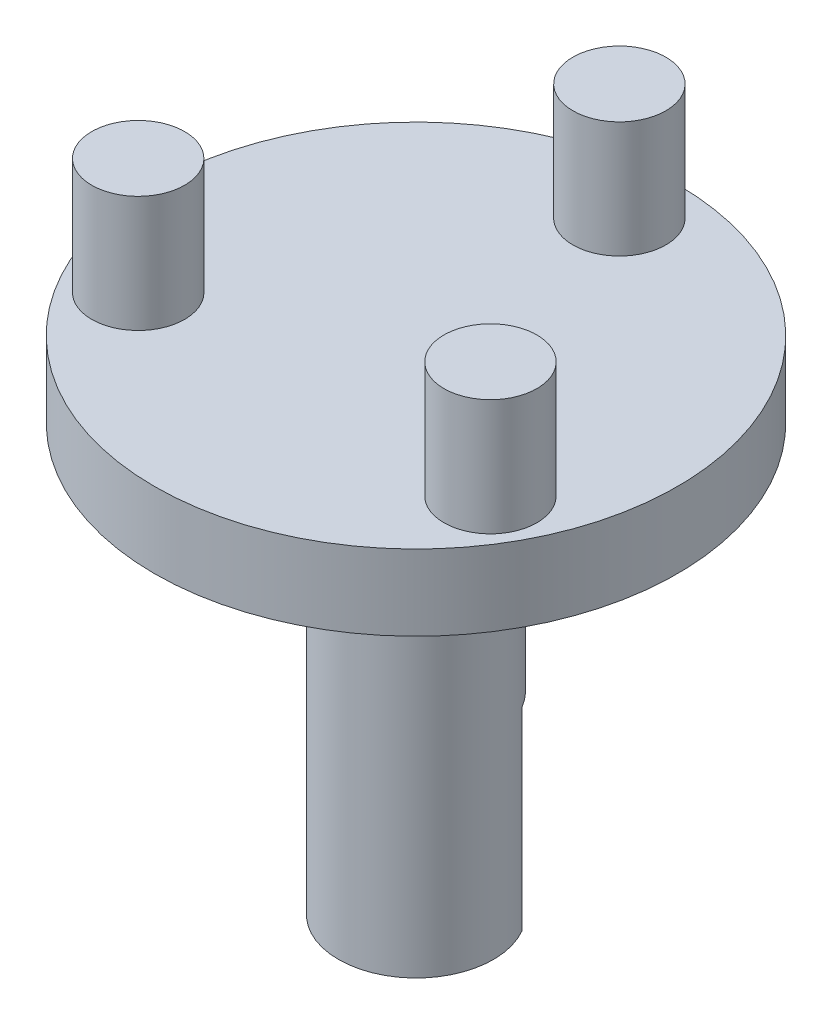
ISO-10303-21;
HEADER;
FILE_DESCRIPTION(('STEP AP214'),'2;1');
FILE_NAME('part.step','',(''),(''),'','','');
FILE_SCHEMA(('AUTOMOTIVE_DESIGN { 1 0 10303 214 1 1 1 1 }'));
ENDSEC;
DATA;
#1=APPLICATION_CONTEXT('core data for automotive mechanical design processes');
#2=APPLICATION_PROTOCOL_DEFINITION('international standard','automotive_design',2000,#1);
#3=PRODUCT_CONTEXT('',#1,'mechanical');
#4=PRODUCT('Part','Part','',(#3));
#5=PRODUCT_RELATED_PRODUCT_CATEGORY('part','',(#4));
#6=PRODUCT_DEFINITION_FORMATION('','',#4);
#7=PRODUCT_DEFINITION_CONTEXT('part definition',#1,'design');
#8=PRODUCT_DEFINITION('design','',#6,#7);
#9=PRODUCT_DEFINITION_SHAPE('','',#8);
#10=(LENGTH_UNIT() NAMED_UNIT(*) SI_UNIT(.MILLI.,.METRE.));
#11=(NAMED_UNIT(*) PLANE_ANGLE_UNIT() SI_UNIT($,.RADIAN.));
#12=(NAMED_UNIT(*) SI_UNIT($,.STERADIAN.) SOLID_ANGLE_UNIT());
#13=UNCERTAINTY_MEASURE_WITH_UNIT(LENGTH_MEASURE(1.E-05),#10,'distance_accuracy_value','');
#14=(GEOMETRIC_REPRESENTATION_CONTEXT(3) GLOBAL_UNCERTAINTY_ASSIGNED_CONTEXT((#13)) GLOBAL_UNIT_ASSIGNED_CONTEXT((#10,
#11,#12)) REPRESENTATION_CONTEXT('',''));
#15=CARTESIAN_POINT('',(0.,0.,0.));
#16=DIRECTION('',(0.,0.,1.));
#17=DIRECTION('',(1.,0.,0.));
#18=AXIS2_PLACEMENT_3D('',#15,#16,#17);
#19=CARTESIAN_POINT('',(0.,3.9,0.));
#20=DIRECTION('',(0.,-1.,0.));
#21=DIRECTION('',(0.,0.,-1.));
#22=AXIS2_PLACEMENT_3D('',#19,#20,#21);
#23=CYLINDRICAL_SURFACE('',#22,13.5);
#24=CARTESIAN_POINT('',(0.,3.9,0.));
#25=DIRECTION('',(0.,1.,0.));
#26=DIRECTION('',(0.,0.,1.));
#27=AXIS2_PLACEMENT_3D('',#24,#25,#26);
#28=CIRCLE('',#27,13.5);
#29=CARTESIAN_POINT('',(0.,3.9,13.5));
#30=VERTEX_POINT('',#29);
#31=EDGE_CURVE('E46',#30,#30,#28,.T.);
#32=ORIENTED_EDGE('',*,*,#31,.F.);
#33=EDGE_LOOP('',(#32));
#34=FACE_BOUND('',#33,.T.);
#35=CARTESIAN_POINT('',(0.,0.,0.));
#36=DIRECTION('',(0.,1.,0.));
#37=DIRECTION('',(0.,0.,1.));
#38=AXIS2_PLACEMENT_3D('',#35,#36,#37);
#39=CIRCLE('',#38,13.5);
#40=CARTESIAN_POINT('',(0.,0.,13.5));
#41=VERTEX_POINT('',#40);
#42=EDGE_CURVE('E111',#41,#41,#39,.T.);
#43=ORIENTED_EDGE('',*,*,#42,.T.);
#44=EDGE_LOOP('',(#43));
#45=FACE_BOUND('',#44,.T.);
#46=ADVANCED_FACE('F38',(#34,#45),#23,.T.);
#47=CARTESIAN_POINT('',(0.,3.9,0.));
#48=DIRECTION('',(0.,1.,0.));
#49=DIRECTION('',(0.,0.,1.));
#50=AXIS2_PLACEMENT_3D('',#47,#48,#49);
#51=PLANE('',#50);
#52=CARTESIAN_POINT('',(-9.09326673973594,3.9,5.25000000000039));
#53=DIRECTION('',(0.,1.,0.));
#54=DIRECTION('',(0.,0.,1.));
#55=AXIS2_PLACEMENT_3D('',#52,#53,#54);
#56=CIRCLE('',#55,2.4);
#57=CARTESIAN_POINT('',(-9.09326673973594,3.9,7.65000000000039));
#58=VERTEX_POINT('',#57);
#59=EDGE_CURVE('E95',#58,#58,#56,.T.);
#60=ORIENTED_EDGE('',*,*,#59,.F.);
#61=EDGE_LOOP('',(#60));
#62=FACE_BOUND('',#61,.T.);
#63=CARTESIAN_POINT('',(9.09326673973728,3.9,5.24999999999961));
#64=DIRECTION('',(0.,1.,0.));
#65=DIRECTION('',(0.,0.,1.));
#66=AXIS2_PLACEMENT_3D('',#63,#64,#65);
#67=CIRCLE('',#66,2.4);
#68=CARTESIAN_POINT('',(9.09326673973728,3.9,7.64999999999961));
#69=VERTEX_POINT('',#68);
#70=EDGE_CURVE('E94',#69,#69,#67,.T.);
#71=ORIENTED_EDGE('',*,*,#70,.F.);
#72=EDGE_LOOP('',(#71));
#73=FACE_BOUND('',#72,.T.);
#74=CARTESIAN_POINT('',(0.,3.9,-10.5));
#75=DIRECTION('',(0.,1.,0.));
#76=DIRECTION('',(0.,0.,1.));
#77=AXIS2_PLACEMENT_3D('',#74,#75,#76);
#78=CIRCLE('',#77,2.4);
#79=CARTESIAN_POINT('',(0.,3.9,-8.1));
#80=VERTEX_POINT('',#79);
#81=EDGE_CURVE('E103',#80,#80,#78,.T.);
#82=ORIENTED_EDGE('',*,*,#81,.F.);
#83=EDGE_LOOP('',(#82));
#84=FACE_BOUND('',#83,.T.);
#85=ORIENTED_EDGE('',*,*,#31,.T.);
#86=EDGE_LOOP('',(#85));
#87=FACE_BOUND('',#86,.T.);
#88=ADVANCED_FACE('F141',(#62,#73,#84,#87),#51,.T.);
#89=CARTESIAN_POINT('',(0.,0.,0.));
#90=DIRECTION('',(0.,1.,0.));
#91=DIRECTION('',(0.,0.,1.));
#92=AXIS2_PLACEMENT_3D('',#89,#90,#91);
#93=PLANE('',#92);
#94=CARTESIAN_POINT('',(0.,0.,0.));
#95=DIRECTION('',(0.,1.,0.));
#96=DIRECTION('',(0.,0.,1.));
#97=AXIS2_PLACEMENT_3D('',#94,#95,#96);
#98=CIRCLE('',#97,5.5);
#99=CARTESIAN_POINT('',(0.,0.,5.5));
#100=VERTEX_POINT('',#99);
#101=EDGE_CURVE('E11',#100,#100,#98,.F.);
#102=ORIENTED_EDGE('',*,*,#101,.F.);
#103=EDGE_LOOP('',(#102));
#104=FACE_BOUND('',#103,.T.);
#105=ORIENTED_EDGE('',*,*,#42,.F.);
#106=EDGE_LOOP('',(#105));
#107=FACE_BOUND('',#106,.T.);
#108=ADVANCED_FACE('F137',(#104,#107),#93,.F.);
#109=CARTESIAN_POINT('',(0.,9.9,-10.5));
#110=DIRECTION('',(0.,-1.,0.));
#111=DIRECTION('',(0.,0.,-1.));
#112=AXIS2_PLACEMENT_3D('',#109,#110,#111);
#113=CYLINDRICAL_SURFACE('',#112,2.4);
#114=CARTESIAN_POINT('',(0.,9.9,-10.5));
#115=DIRECTION('',(0.,1.,0.));
#116=DIRECTION('',(0.,0.,1.));
#117=AXIS2_PLACEMENT_3D('',#114,#115,#116);
#118=CIRCLE('',#117,2.4);
#119=CARTESIAN_POINT('',(0.,9.9,-8.1));
#120=VERTEX_POINT('',#119);
#121=EDGE_CURVE('E107',#120,#120,#118,.T.);
#122=ORIENTED_EDGE('',*,*,#121,.F.);
#123=EDGE_LOOP('',(#122));
#124=FACE_BOUND('',#123,.T.);
#125=ORIENTED_EDGE('',*,*,#81,.T.);
#126=EDGE_LOOP('',(#125));
#127=FACE_BOUND('',#126,.T.);
#128=ADVANCED_FACE('F140',(#124,#127),#113,.T.);
#129=CARTESIAN_POINT('',(0.,9.9,-10.5));
#130=DIRECTION('',(0.,1.,0.));
#131=DIRECTION('',(0.,0.,1.));
#132=AXIS2_PLACEMENT_3D('',#129,#130,#131);
#133=PLANE('',#132);
#134=ORIENTED_EDGE('',*,*,#121,.T.);
#135=EDGE_LOOP('',(#134));
#136=FACE_BOUND('',#135,.T.);
#137=ADVANCED_FACE('F160',(#136),#133,.T.);
#138=CARTESIAN_POINT('',(9.09326673973728,9.9,5.24999999999961));
#139=DIRECTION('',(0.,-1.,0.));
#140=DIRECTION('',(0.,0.,-1.));
#141=AXIS2_PLACEMENT_3D('',#138,#139,#140);
#142=CYLINDRICAL_SURFACE('',#141,2.4);
#143=CARTESIAN_POINT('',(9.09326673973728,9.9,5.24999999999961));
#144=DIRECTION('',(0.,1.,0.));
#145=DIRECTION('',(0.,0.,1.));
#146=AXIS2_PLACEMENT_3D('',#143,#144,#145);
#147=CIRCLE('',#146,2.4);
#148=CARTESIAN_POINT('',(9.09326673973728,9.9,7.64999999999961));
#149=VERTEX_POINT('',#148);
#150=EDGE_CURVE('E99',#149,#149,#147,.T.);
#151=ORIENTED_EDGE('',*,*,#150,.F.);
#152=EDGE_LOOP('',(#151));
#153=FACE_BOUND('',#152,.T.);
#154=ORIENTED_EDGE('',*,*,#70,.T.);
#155=EDGE_LOOP('',(#154));
#156=FACE_BOUND('',#155,.T.);
#157=ADVANCED_FACE('F164',(#153,#156),#142,.T.);
#158=CARTESIAN_POINT('',(9.09326673973728,9.9,5.24999999999961));
#159=DIRECTION('',(0.,1.,0.));
#160=DIRECTION('',(0.,0.,1.));
#161=AXIS2_PLACEMENT_3D('',#158,#159,#160);
#162=PLANE('',#161);
#163=ORIENTED_EDGE('',*,*,#150,.T.);
#164=EDGE_LOOP('',(#163));
#165=FACE_BOUND('',#164,.T.);
#166=ADVANCED_FACE('F168',(#165),#162,.T.);
#167=CARTESIAN_POINT('',(-9.09326673973594,9.9,5.25000000000039));
#168=DIRECTION('',(0.,-1.,0.));
#169=DIRECTION('',(0.,0.,-1.));
#170=AXIS2_PLACEMENT_3D('',#167,#168,#169);
#171=CYLINDRICAL_SURFACE('',#170,2.4);
#172=CARTESIAN_POINT('',(-9.09326673973594,9.9,5.25000000000039));
#173=DIRECTION('',(0.,1.,0.));
#174=DIRECTION('',(0.,0.,1.));
#175=AXIS2_PLACEMENT_3D('',#172,#173,#174);
#176=CIRCLE('',#175,2.4);
#177=CARTESIAN_POINT('',(-9.09326673973594,9.9,7.65000000000039));
#178=VERTEX_POINT('',#177);
#179=EDGE_CURVE('E90',#178,#178,#176,.T.);
#180=ORIENTED_EDGE('',*,*,#179,.F.);
#181=EDGE_LOOP('',(#180));
#182=FACE_BOUND('',#181,.T.);
#183=ORIENTED_EDGE('',*,*,#59,.T.);
#184=EDGE_LOOP('',(#183));
#185=FACE_BOUND('',#184,.T.);
#186=ADVANCED_FACE('F172',(#182,#185),#171,.T.);
#187=CARTESIAN_POINT('',(-9.09326673973594,9.9,5.25000000000039));
#188=DIRECTION('',(0.,1.,0.));
#189=DIRECTION('',(0.,0.,1.));
#190=AXIS2_PLACEMENT_3D('',#187,#188,#189);
#191=PLANE('',#190);
#192=ORIENTED_EDGE('',*,*,#179,.T.);
#193=EDGE_LOOP('',(#192));
#194=FACE_BOUND('',#193,.T.);
#195=ADVANCED_FACE('F133',(#194),#191,.T.);
#196=CARTESIAN_POINT('',(0.,-1.,0.));
#197=DIRECTION('',(0.,1.,0.));
#198=DIRECTION('',(0.,0.,1.));
#199=AXIS2_PLACEMENT_3D('',#196,#197,#198);
#200=CYLINDRICAL_SURFACE('',#199,5.5);
#201=CARTESIAN_POINT('',(0.,-1.,0.));
#202=DIRECTION('',(0.,-1.,0.));
#203=DIRECTION('',(0.,0.,-1.));
#204=AXIS2_PLACEMENT_3D('',#201,#202,#203);
#205=CIRCLE('',#204,5.5);
#206=CARTESIAN_POINT('',(0.,-1.,-5.5));
#207=VERTEX_POINT('',#206);
#208=EDGE_CURVE('E82',#207,#207,#205,.T.);
#209=ORIENTED_EDGE('',*,*,#208,.F.);
#210=EDGE_LOOP('',(#209));
#211=FACE_BOUND('',#210,.T.);
#212=ORIENTED_EDGE('',*,*,#101,.T.);
#213=EDGE_LOOP('',(#212));
#214=FACE_BOUND('',#213,.T.);
#215=ADVANCED_FACE('F127',(#211,#214),#200,.T.);
#216=CARTESIAN_POINT('',(0.,-1.,0.));
#217=DIRECTION('',(0.,-1.,0.));
#218=DIRECTION('',(0.,0.,-1.));
#219=AXIS2_PLACEMENT_3D('',#216,#217,#218);
#220=PLANE('',#219);
#221=CARTESIAN_POINT('',(0.,-1.,0.));
#222=DIRECTION('',(0.,-1.,0.));
#223=DIRECTION('',(0.,0.,-1.));
#224=AXIS2_PLACEMENT_3D('',#221,#222,#223);
#225=CIRCLE('',#224,4.);
#226=CARTESIAN_POINT('',(0.,-1.,-4.));
#227=VERTEX_POINT('',#226);
#228=EDGE_CURVE('E86',#227,#227,#225,.T.);
#229=ORIENTED_EDGE('',*,*,#228,.F.);
#230=EDGE_LOOP('',(#229));
#231=FACE_BOUND('',#230,.T.);
#232=ORIENTED_EDGE('',*,*,#208,.T.);
#233=EDGE_LOOP('',(#232));
#234=FACE_BOUND('',#233,.T.);
#235=ADVANCED_FACE('F124',(#231,#234),#220,.T.);
#236=CARTESIAN_POINT('',(0.,-7.,0.));
#237=DIRECTION('',(0.,1.,0.));
#238=DIRECTION('',(0.,0.,1.));
#239=AXIS2_PLACEMENT_3D('',#236,#237,#238);
#240=CYLINDRICAL_SURFACE('',#239,4.);
#241=CARTESIAN_POINT('',(0.,-22.,0.));
#242=DIRECTION('',(0.,-1.,0.));
#243=DIRECTION('',(0.,0.,-1.));
#244=AXIS2_PLACEMENT_3D('',#241,#242,#243);
#245=CIRCLE('',#244,4.);
#246=CARTESIAN_POINT('',(3.46410161513775,-22.,-2.));
#247=VERTEX_POINT('',#246);
#248=CARTESIAN_POINT('',(-3.46410161513775,-22.,-2.));
#249=VERTEX_POINT('',#248);
#250=EDGE_CURVE('E77',#247,#249,#245,.T.);
#251=ORIENTED_EDGE('',*,*,#250,.F.);
#252=DIRECTION('',(0.,-1.,0.));
#253=VECTOR('',#252,1.);
#254=CARTESIAN_POINT('',(3.46410161513775,-12.,-2.));
#255=LINE('',#254,#253);
#256=CARTESIAN_POINT('',(3.46410161513775,-12.,-2.));
#257=VERTEX_POINT('',#256);
#258=EDGE_CURVE('E53',#257,#247,#255,.T.);
#259=ORIENTED_EDGE('',*,*,#258,.F.);
#260=CARTESIAN_POINT('',(0.,-12.,0.));
#261=DIRECTION('',(0.,-1.,0.));
#262=DIRECTION('',(0.,0.,-1.));
#263=AXIS2_PLACEMENT_3D('',#260,#261,#262);
#264=CIRCLE('',#263,4.);
#265=CARTESIAN_POINT('',(-3.46410161513775,-12.,-2.));
#266=VERTEX_POINT('',#265);
#267=EDGE_CURVE('E70',#266,#257,#264,.T.);
#268=ORIENTED_EDGE('',*,*,#267,.F.);
#269=DIRECTION('',(0.,-1.,0.));
#270=VECTOR('',#269,1.);
#271=CARTESIAN_POINT('',(-3.46410161513775,-12.,-2.));
#272=LINE('',#271,#270);
#273=EDGE_CURVE('E59',#266,#249,#272,.T.);
#274=ORIENTED_EDGE('',*,*,#273,.T.);
#275=EDGE_LOOP('',(#251,#259,#268,#274));
#276=FACE_BOUND('',#275,.T.);
#277=ORIENTED_EDGE('',*,*,#228,.T.);
#278=EDGE_LOOP('',(#277));
#279=FACE_BOUND('',#278,.T.);
#280=ADVANCED_FACE('F75',(#276,#279),#240,.T.);
#281=CARTESIAN_POINT('',(0.,-22.,0.));
#282=DIRECTION('',(0.,-1.,0.));
#283=DIRECTION('',(0.,0.,-1.));
#284=AXIS2_PLACEMENT_3D('',#281,#282,#283);
#285=PLANE('',#284);
#286=DIRECTION('',(-1.,0.,0.));
#287=VECTOR('',#286,1.);
#288=CARTESIAN_POINT('',(3.46410161513775,-22.,-2.));
#289=LINE('',#288,#287);
#290=EDGE_CURVE('E64',#247,#249,#289,.T.);
#291=ORIENTED_EDGE('',*,*,#290,.F.);
#292=ORIENTED_EDGE('',*,*,#250,.T.);
#293=EDGE_LOOP('',(#291,#292));
#294=FACE_BOUND('',#293,.T.);
#295=ADVANCED_FACE('F80',(#294),#285,.T.);
#296=CARTESIAN_POINT('',(3.46410161513775,-12.,-2.));
#297=DIRECTION('',(0.,0.,1.));
#298=DIRECTION('',(1.,0.,0.));
#299=AXIS2_PLACEMENT_3D('',#296,#297,#298);
#300=PLANE('',#299);
#301=CARTESIAN_POINT('',(0.,-15.5,-2.));
#302=DIRECTION('',(0.,0.,-1.));
#303=DIRECTION('',(-1.,0.,0.));
#304=AXIS2_PLACEMENT_3D('',#301,#302,#303);
#305=CIRCLE('',#304,1.5);
#306=CARTESIAN_POINT('',(-1.5,-15.5,-2.));
#307=VERTEX_POINT('',#306);
#308=EDGE_CURVE('E203',#307,#307,#305,.T.);
#309=ORIENTED_EDGE('',*,*,#308,.F.);
#310=EDGE_LOOP('',(#309));
#311=FACE_BOUND('',#310,.T.);
#312=ORIENTED_EDGE('',*,*,#290,.T.);
#313=ORIENTED_EDGE('',*,*,#273,.F.);
#314=DIRECTION('',(-1.,0.,0.));
#315=VECTOR('',#314,1.);
#316=CARTESIAN_POINT('',(3.46410161513775,-12.,-2.));
#317=LINE('',#316,#315);
#318=EDGE_CURVE('E211',#257,#266,#317,.T.);
#319=ORIENTED_EDGE('',*,*,#318,.F.);
#320=ORIENTED_EDGE('',*,*,#258,.T.);
#321=EDGE_LOOP('',(#312,#313,#319,#320));
#322=FACE_BOUND('',#321,.T.);
#323=ADVANCED_FACE('F65',(#311,#322),#300,.F.);
#324=CARTESIAN_POINT('',(0.,-12.,0.));
#325=DIRECTION('',(0.,-1.,0.));
#326=DIRECTION('',(0.,0.,-1.));
#327=AXIS2_PLACEMENT_3D('',#324,#325,#326);
#328=PLANE('',#327);
#329=ORIENTED_EDGE('',*,*,#267,.T.);
#330=ORIENTED_EDGE('',*,*,#318,.T.);
#331=EDGE_LOOP('',(#329,#330));
#332=FACE_BOUND('',#331,.T.);
#333=ADVANCED_FACE('F186',(#332),#328,.T.);
#334=CARTESIAN_POINT('',(0.,-15.5,-1.));
#335=DIRECTION('',(0.,0.,-1.));
#336=DIRECTION('',(-1.,0.,0.));
#337=AXIS2_PLACEMENT_3D('',#334,#335,#336);
#338=CYLINDRICAL_SURFACE('',#337,1.5);
#339=CARTESIAN_POINT('',(0.,-15.5,-1.));
#340=DIRECTION('',(0.,0.,-1.));
#341=DIRECTION('',(-1.,0.,0.));
#342=AXIS2_PLACEMENT_3D('',#339,#340,#341);
#343=CIRCLE('',#342,1.5);
#344=CARTESIAN_POINT('',(-1.5,-15.5,-1.));
#345=VERTEX_POINT('',#344);
#346=EDGE_CURVE('E71',#345,#345,#343,.T.);
#347=ORIENTED_EDGE('',*,*,#346,.F.);
#348=EDGE_LOOP('',(#347));
#349=FACE_BOUND('',#348,.T.);
#350=ORIENTED_EDGE('',*,*,#308,.T.);
#351=EDGE_LOOP('',(#350));
#352=FACE_BOUND('',#351,.T.);
#353=ADVANCED_FACE('F190',(#349,#352),#338,.F.);
#354=CARTESIAN_POINT('',(0.,-15.5,-1.));
#355=DIRECTION('',(0.,0.,-1.));
#356=DIRECTION('',(-1.,0.,0.));
#357=AXIS2_PLACEMENT_3D('',#354,#355,#356);
#358=PLANE('',#357);
#359=ORIENTED_EDGE('',*,*,#346,.T.);
#360=EDGE_LOOP('',(#359));
#361=FACE_BOUND('',#360,.T.);
#362=ADVANCED_FACE('F194',(#361),#358,.T.);
#363=CLOSED_SHELL('',(#46,#88,#108,#128,#137,#157,#166,#186,#195,#215,#235,#280,#295,#323,#333,
#353,#362));
#364=MANIFOLD_SOLID_BREP('B2',#363);
#365=ADVANCED_BREP_SHAPE_REPRESENTATION('',(#18,#364),#14);
#366=SHAPE_DEFINITION_REPRESENTATION(#9,#365);
ENDSEC;
END-ISO-10303-21;
